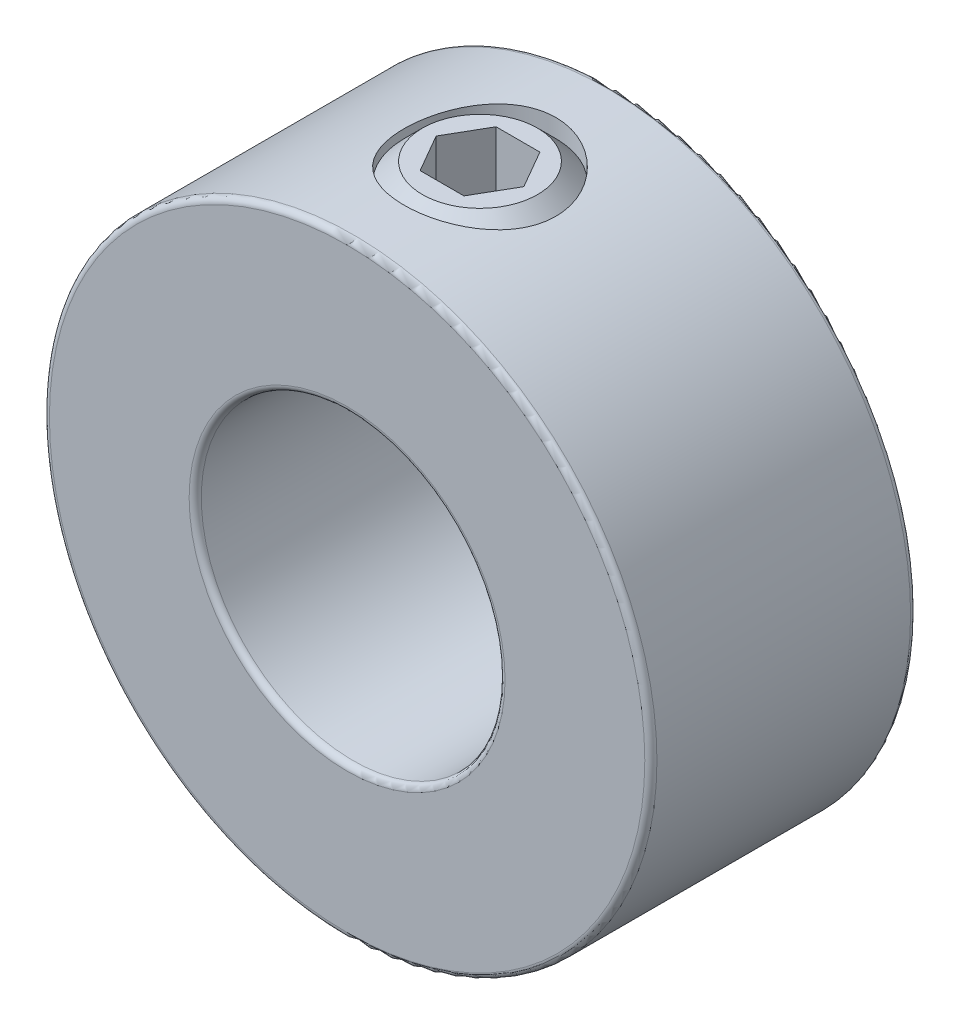
ISO-10303-21;
HEADER;
FILE_DESCRIPTION(('STEP AP214'),'2;1');
FILE_NAME('part.step','',(''),(''),'','','');
FILE_SCHEMA(('AUTOMOTIVE_DESIGN { 1 0 10303 214 1 1 1 1 }'));
ENDSEC;
DATA;
#1=APPLICATION_CONTEXT('core data for automotive mechanical design processes');
#2=APPLICATION_PROTOCOL_DEFINITION('international standard','automotive_design',2000,#1);
#3=PRODUCT_CONTEXT('',#1,'mechanical');
#4=PRODUCT('Part','Part','',(#3));
#5=PRODUCT_RELATED_PRODUCT_CATEGORY('part','',(#4));
#6=PRODUCT_DEFINITION_FORMATION('','',#4);
#7=PRODUCT_DEFINITION_CONTEXT('part definition',#1,'design');
#8=PRODUCT_DEFINITION('design','',#6,#7);
#9=PRODUCT_DEFINITION_SHAPE('','',#8);
#10=(LENGTH_UNIT() NAMED_UNIT(*) SI_UNIT(.MILLI.,.METRE.));
#11=(NAMED_UNIT(*) PLANE_ANGLE_UNIT() SI_UNIT($,.RADIAN.));
#12=(NAMED_UNIT(*) SI_UNIT($,.STERADIAN.) SOLID_ANGLE_UNIT());
#13=UNCERTAINTY_MEASURE_WITH_UNIT(LENGTH_MEASURE(1.E-05),#10,'distance_accuracy_value','');
#14=(GEOMETRIC_REPRESENTATION_CONTEXT(3) GLOBAL_UNCERTAINTY_ASSIGNED_CONTEXT((#13)) GLOBAL_UNIT_ASSIGNED_CONTEXT((#10,
#11,#12)) REPRESENTATION_CONTEXT('',''));
#15=CARTESIAN_POINT('',(0.,0.,0.));
#16=DIRECTION('',(0.,0.,1.));
#17=DIRECTION('',(1.,0.,0.));
#18=AXIS2_PLACEMENT_3D('',#15,#16,#17);
#19=CARTESIAN_POINT('',(0.,12.7,0.));
#20=DIRECTION('',(0.,1.,0.));
#21=DIRECTION('',(-1.,0.,0.));
#22=AXIS2_PLACEMENT_3D('',#19,#20,#21);
#23=PLANE('',#22);
#24=CARTESIAN_POINT('',(0.,12.7,0.));
#25=DIRECTION('',(0.,1.,0.));
#26=DIRECTION('',(-1.,0.,0.));
#27=AXIS2_PLACEMENT_3D('',#24,#25,#26);
#28=CIRCLE('',#27,2.40819263124403);
#29=CARTESIAN_POINT('',(-2.40819263124403,12.7,0.));
#30=VERTEX_POINT('',#29);
#31=EDGE_CURVE('E12',#30,#30,#28,.T.);
#32=ORIENTED_EDGE('',*,*,#31,.T.);
#33=EDGE_LOOP('',(#32));
#34=FACE_BOUND('',#33,.T.);
#35=DIRECTION('',(1.,0.,0.));
#36=VECTOR('',#35,1.);
#37=CARTESIAN_POINT('',(-0.916543552338532,12.7,-1.5875));
#38=LINE('',#37,#36);
#39=CARTESIAN_POINT('',(-0.916543552338532,12.7,-1.5875));
#40=VERTEX_POINT('',#39);
#41=CARTESIAN_POINT('',(0.916543552338531,12.7,-1.5875));
#42=VERTEX_POINT('',#41);
#43=EDGE_CURVE('E108',#40,#42,#38,.T.);
#44=ORIENTED_EDGE('',*,*,#43,.T.);
#45=DIRECTION('',(0.5,0.,0.866025403784439));
#46=VECTOR('',#45,1.);
#47=CARTESIAN_POINT('',(0.916543552338531,12.7,-1.5875));
#48=LINE('',#47,#46);
#49=CARTESIAN_POINT('',(1.83308710467706,12.7,0.));
#50=VERTEX_POINT('',#49);
#51=EDGE_CURVE('E54',#42,#50,#48,.T.);
#52=ORIENTED_EDGE('',*,*,#51,.T.);
#53=DIRECTION('',(-0.5,0.,0.866025403784439));
#54=VECTOR('',#53,1.);
#55=CARTESIAN_POINT('',(1.83308710467706,12.7,0.));
#56=LINE('',#55,#54);
#57=CARTESIAN_POINT('',(0.916543552338533,12.7,1.5875));
#58=VERTEX_POINT('',#57);
#59=EDGE_CURVE('E112',#50,#58,#56,.T.);
#60=ORIENTED_EDGE('',*,*,#59,.T.);
#61=DIRECTION('',(-1.,0.,0.));
#62=VECTOR('',#61,1.);
#63=CARTESIAN_POINT('',(0.916543552338533,12.7,1.5875));
#64=LINE('',#63,#62);
#65=CARTESIAN_POINT('',(-0.916543552338531,12.7,1.5875));
#66=VERTEX_POINT('',#65);
#67=EDGE_CURVE('E175',#58,#66,#64,.T.);
#68=ORIENTED_EDGE('',*,*,#67,.T.);
#69=DIRECTION('',(-0.5,0.,-0.866025403784439));
#70=VECTOR('',#69,1.);
#71=CARTESIAN_POINT('',(-0.916543552338531,12.7,1.5875));
#72=LINE('',#71,#70);
#73=CARTESIAN_POINT('',(-1.83308710467706,12.7,0.));
#74=VERTEX_POINT('',#73);
#75=EDGE_CURVE('E160',#66,#74,#72,.T.);
#76=ORIENTED_EDGE('',*,*,#75,.T.);
#77=DIRECTION('',(0.5,0.,-0.866025403784439));
#78=VECTOR('',#77,1.);
#79=CARTESIAN_POINT('',(-1.83308710467706,12.7,0.));
#80=LINE('',#79,#78);
#81=EDGE_CURVE('E156',#74,#40,#80,.T.);
#82=ORIENTED_EDGE('',*,*,#81,.T.);
#83=EDGE_LOOP('',(#44,#52,#60,#68,#76,#82));
#84=FACE_BOUND('',#83,.T.);
#85=ADVANCED_FACE('F40',(#34,#84),#23,.T.);
#86=CARTESIAN_POINT('',(0.,12.7,0.));
#87=DIRECTION('',(0.,-1.,0.));
#88=DIRECTION('',(1.,0.,0.));
#89=AXIS2_PLACEMENT_3D('',#86,#87,#88);
#90=CONICAL_SURFACE('',#89,2.40819263124403,0.785398163397448);
#91=CARTESIAN_POINT('',(0.,11.933192631244,0.));
#92=DIRECTION('',(0.,1.,0.));
#93=DIRECTION('',(-1.,0.,0.));
#94=AXIS2_PLACEMENT_3D('',#91,#92,#93);
#95=CIRCLE('',#94,3.175);
#96=CARTESIAN_POINT('',(-3.175,11.933192631244,0.));
#97=VERTEX_POINT('',#96);
#98=EDGE_CURVE('E47',#97,#97,#95,.T.);
#99=ORIENTED_EDGE('',*,*,#98,.T.);
#100=EDGE_LOOP('',(#99));
#101=FACE_BOUND('',#100,.T.);
#102=ORIENTED_EDGE('',*,*,#31,.F.);
#103=EDGE_LOOP('',(#102));
#104=FACE_BOUND('',#103,.T.);
#105=ADVANCED_FACE('F130',(#101,#104),#90,.T.);
#106=CARTESIAN_POINT('',(0.,6.35,0.));
#107=DIRECTION('',(0.,1.,0.));
#108=DIRECTION('',(-1.,0.,0.));
#109=AXIS2_PLACEMENT_3D('',#106,#107,#108);
#110=CYLINDRICAL_SURFACE('',#109,3.175);
#111=CARTESIAN_POINT('',(0.,7.11680736875596,0.));
#112=DIRECTION('',(0.,1.,0.));
#113=DIRECTION('',(-1.,0.,0.));
#114=AXIS2_PLACEMENT_3D('',#111,#112,#113);
#115=CIRCLE('',#114,3.175);
#116=CARTESIAN_POINT('',(-3.175,7.11680736875596,0.));
#117=VERTEX_POINT('',#116);
#118=EDGE_CURVE('E125',#117,#117,#115,.T.);
#119=ORIENTED_EDGE('',*,*,#118,.T.);
#120=EDGE_LOOP('',(#119));
#121=FACE_BOUND('',#120,.T.);
#122=ORIENTED_EDGE('',*,*,#98,.F.);
#123=EDGE_LOOP('',(#122));
#124=FACE_BOUND('',#123,.T.);
#125=ADVANCED_FACE('F133',(#121,#124),#110,.T.);
#126=CARTESIAN_POINT('',(0.,7.11680736875596,0.));
#127=DIRECTION('',(0.,1.,0.));
#128=DIRECTION('',(-1.,0.,0.));
#129=AXIS2_PLACEMENT_3D('',#126,#127,#128);
#130=CONICAL_SURFACE('',#129,3.175,0.785398163397449);
#131=CARTESIAN_POINT('',(0.,6.35,0.));
#132=DIRECTION('',(0.,1.,0.));
#133=DIRECTION('',(-1.,0.,0.));
#134=AXIS2_PLACEMENT_3D('',#131,#132,#133);
#135=CIRCLE('',#134,2.40819263124403);
#136=CARTESIAN_POINT('',(-2.40819263124403,6.35,0.));
#137=VERTEX_POINT('',#136);
#138=EDGE_CURVE('E117',#137,#137,#135,.T.);
#139=ORIENTED_EDGE('',*,*,#138,.T.);
#140=EDGE_LOOP('',(#139));
#141=FACE_BOUND('',#140,.T.);
#142=ORIENTED_EDGE('',*,*,#118,.F.);
#143=EDGE_LOOP('',(#142));
#144=FACE_BOUND('',#143,.T.);
#145=ADVANCED_FACE('F135',(#141,#144),#130,.T.);
#146=CARTESIAN_POINT('',(-2.40819263124403,6.35,0.));
#147=DIRECTION('',(0.,-1.,0.));
#148=DIRECTION('',(1.,0.,0.));
#149=AXIS2_PLACEMENT_3D('',#146,#147,#148);
#150=PLANE('',#149);
#151=CARTESIAN_POINT('',(0.,6.35,0.));
#152=DIRECTION('',(0.,1.,0.));
#153=DIRECTION('',(-1.,0.,0.));
#154=AXIS2_PLACEMENT_3D('',#151,#152,#153);
#155=CIRCLE('',#154,0.920168842507158);
#156=CARTESIAN_POINT('',(-0.920168842507158,6.35,0.));
#157=VERTEX_POINT('',#156);
#158=EDGE_CURVE('E113',#157,#157,#155,.T.);
#159=ORIENTED_EDGE('',*,*,#158,.T.);
#160=EDGE_LOOP('',(#159));
#161=FACE_BOUND('',#160,.T.);
#162=ORIENTED_EDGE('',*,*,#138,.F.);
#163=EDGE_LOOP('',(#162));
#164=FACE_BOUND('',#163,.T.);
#165=ADVANCED_FACE('F142',(#161,#164),#150,.T.);
#166=CARTESIAN_POINT('',(0.,6.35,0.));
#167=DIRECTION('',(0.,-1.,0.));
#168=DIRECTION('',(1.,0.,0.));
#169=AXIS2_PLACEMENT_3D('',#166,#167,#168);
#170=CONICAL_SURFACE('',#169,0.920168842507158,0.785398163397448);
#171=CARTESIAN_POINT('',(0.,7.27016884250716,0.));
#172=VERTEX_POINT('',#171);
#173=VERTEX_LOOP('',#172);
#174=FACE_BOUND('',#173,.T.);
#175=ORIENTED_EDGE('',*,*,#158,.F.);
#176=EDGE_LOOP('',(#175));
#177=FACE_BOUND('',#176,.T.);
#178=ADVANCED_FACE('F209',(#174,#177),#170,.F.);
#179=CARTESIAN_POINT('',(0.916543552338531,9.52499999999999,-1.5875));
#180=DIRECTION('',(-0.866025403784439,0.,0.5));
#181=DIRECTION('',(0.5,0.,0.866025403784439));
#182=AXIS2_PLACEMENT_3D('',#179,#180,#181);
#183=PLANE('',#182);
#184=ORIENTED_EDGE('',*,*,#51,.F.);
#185=DIRECTION('',(0.,1.,0.));
#186=VECTOR('',#185,1.);
#187=CARTESIAN_POINT('',(0.916543552338531,9.52499999999999,-1.5875));
#188=LINE('',#187,#186);
#189=CARTESIAN_POINT('',(0.916543552338531,9.52499999999999,-1.5875));
#190=VERTEX_POINT('',#189);
#191=EDGE_CURVE('E107',#190,#42,#188,.T.);
#192=ORIENTED_EDGE('',*,*,#191,.F.);
#193=DIRECTION('',(0.5,0.,0.866025403784439));
#194=VECTOR('',#193,1.);
#195=CARTESIAN_POINT('',(0.916543552338531,9.52499999999999,-1.5875));
#196=LINE('',#195,#194);
#197=CARTESIAN_POINT('',(1.83308710467706,9.52499999999999,0.));
#198=VERTEX_POINT('',#197);
#199=EDGE_CURVE('E98',#190,#198,#196,.T.);
#200=ORIENTED_EDGE('',*,*,#199,.T.);
#201=DIRECTION('',(0.,1.,0.));
#202=VECTOR('',#201,1.);
#203=CARTESIAN_POINT('',(1.83308710467706,9.52499999999999,0.));
#204=LINE('',#203,#202);
#205=EDGE_CURVE('E106',#198,#50,#204,.T.);
#206=ORIENTED_EDGE('',*,*,#205,.T.);
#207=EDGE_LOOP('',(#184,#192,#200,#206));
#208=FACE_BOUND('',#207,.T.);
#209=ADVANCED_FACE('F105',(#208),#183,.T.);
#210=CARTESIAN_POINT('',(1.83308710467706,9.52499999999999,0.));
#211=DIRECTION('',(-0.866025403784439,0.,-0.5));
#212=DIRECTION('',(-0.5,0.,0.866025403784439));
#213=AXIS2_PLACEMENT_3D('',#210,#211,#212);
#214=PLANE('',#213);
#215=ORIENTED_EDGE('',*,*,#59,.F.);
#216=ORIENTED_EDGE('',*,*,#205,.F.);
#217=DIRECTION('',(-0.5,0.,0.866025403784439));
#218=VECTOR('',#217,1.);
#219=CARTESIAN_POINT('',(1.83308710467706,9.52499999999999,0.));
#220=LINE('',#219,#218);
#221=CARTESIAN_POINT('',(0.916543552338533,9.52499999999999,1.5875));
#222=VERTEX_POINT('',#221);
#223=EDGE_CURVE('E94',#198,#222,#220,.T.);
#224=ORIENTED_EDGE('',*,*,#223,.T.);
#225=DIRECTION('',(0.,1.,0.));
#226=VECTOR('',#225,1.);
#227=CARTESIAN_POINT('',(0.916543552338533,9.52499999999999,1.5875));
#228=LINE('',#227,#226);
#229=EDGE_CURVE('E114',#222,#58,#228,.T.);
#230=ORIENTED_EDGE('',*,*,#229,.T.);
#231=EDGE_LOOP('',(#215,#216,#224,#230));
#232=FACE_BOUND('',#231,.T.);
#233=ADVANCED_FACE('F110',(#232),#214,.T.);
#234=CARTESIAN_POINT('',(0.916543552338533,9.52499999999999,1.5875));
#235=DIRECTION('',(0.,0.,-1.));
#236=DIRECTION('',(-1.,0.,0.));
#237=AXIS2_PLACEMENT_3D('',#234,#235,#236);
#238=PLANE('',#237);
#239=ORIENTED_EDGE('',*,*,#67,.F.);
#240=ORIENTED_EDGE('',*,*,#229,.F.);
#241=DIRECTION('',(-1.,0.,0.));
#242=VECTOR('',#241,1.);
#243=CARTESIAN_POINT('',(0.916543552338533,9.52499999999999,1.5875));
#244=LINE('',#243,#242);
#245=CARTESIAN_POINT('',(-0.916543552338531,9.52499999999999,1.5875));
#246=VERTEX_POINT('',#245);
#247=EDGE_CURVE('E100',#222,#246,#244,.T.);
#248=ORIENTED_EDGE('',*,*,#247,.T.);
#249=DIRECTION('',(0.,1.,0.));
#250=VECTOR('',#249,1.);
#251=CARTESIAN_POINT('',(-0.916543552338531,9.52499999999999,1.5875));
#252=LINE('',#251,#250);
#253=EDGE_CURVE('E119',#246,#66,#252,.T.);
#254=ORIENTED_EDGE('',*,*,#253,.T.);
#255=EDGE_LOOP('',(#239,#240,#248,#254));
#256=FACE_BOUND('',#255,.T.);
#257=ADVANCED_FACE('F173',(#256),#238,.T.);
#258=CARTESIAN_POINT('',(-0.916543552338531,9.52499999999999,1.5875));
#259=DIRECTION('',(0.866025403784439,0.,-0.5));
#260=DIRECTION('',(-0.5,0.,-0.866025403784439));
#261=AXIS2_PLACEMENT_3D('',#258,#259,#260);
#262=PLANE('',#261);
#263=ORIENTED_EDGE('',*,*,#75,.F.);
#264=ORIENTED_EDGE('',*,*,#253,.F.);
#265=DIRECTION('',(-0.5,0.,-0.866025403784439));
#266=VECTOR('',#265,1.);
#267=CARTESIAN_POINT('',(-0.916543552338531,9.52499999999999,1.5875));
#268=LINE('',#267,#266);
#269=CARTESIAN_POINT('',(-1.83308710467706,9.52499999999999,0.));
#270=VERTEX_POINT('',#269);
#271=EDGE_CURVE('E186',#246,#270,#268,.T.);
#272=ORIENTED_EDGE('',*,*,#271,.T.);
#273=DIRECTION('',(0.,1.,0.));
#274=VECTOR('',#273,1.);
#275=CARTESIAN_POINT('',(-1.83308710467706,9.52499999999999,0.));
#276=LINE('',#275,#274);
#277=EDGE_CURVE('E168',#270,#74,#276,.T.);
#278=ORIENTED_EDGE('',*,*,#277,.T.);
#279=EDGE_LOOP('',(#263,#264,#272,#278));
#280=FACE_BOUND('',#279,.T.);
#281=ADVANCED_FACE('F177',(#280),#262,.T.);
#282=CARTESIAN_POINT('',(-1.83308710467706,9.52499999999999,0.));
#283=DIRECTION('',(0.866025403784439,0.,0.5));
#284=DIRECTION('',(0.5,0.,-0.866025403784439));
#285=AXIS2_PLACEMENT_3D('',#282,#283,#284);
#286=PLANE('',#285);
#287=ORIENTED_EDGE('',*,*,#81,.F.);
#288=ORIENTED_EDGE('',*,*,#277,.F.);
#289=DIRECTION('',(0.5,0.,-0.866025403784439));
#290=VECTOR('',#289,1.);
#291=CARTESIAN_POINT('',(-1.83308710467706,9.52499999999999,0.));
#292=LINE('',#291,#290);
#293=CARTESIAN_POINT('',(-0.916543552338532,9.52499999999999,-1.5875));
#294=VERTEX_POINT('',#293);
#295=EDGE_CURVE('E184',#270,#294,#292,.T.);
#296=ORIENTED_EDGE('',*,*,#295,.T.);
#297=DIRECTION('',(0.,1.,0.));
#298=VECTOR('',#297,1.);
#299=CARTESIAN_POINT('',(-0.916543552338532,9.52499999999999,-1.5875));
#300=LINE('',#299,#298);
#301=EDGE_CURVE('E165',#294,#40,#300,.T.);
#302=ORIENTED_EDGE('',*,*,#301,.T.);
#303=EDGE_LOOP('',(#287,#288,#296,#302));
#304=FACE_BOUND('',#303,.T.);
#305=ADVANCED_FACE('F190',(#304),#286,.T.);
#306=CARTESIAN_POINT('',(-0.916543552338532,9.52499999999999,-1.5875));
#307=DIRECTION('',(0.,0.,1.));
#308=DIRECTION('',(1.,0.,0.));
#309=AXIS2_PLACEMENT_3D('',#306,#307,#308);
#310=PLANE('',#309);
#311=ORIENTED_EDGE('',*,*,#43,.F.);
#312=ORIENTED_EDGE('',*,*,#301,.F.);
#313=DIRECTION('',(1.,0.,0.));
#314=VECTOR('',#313,1.);
#315=CARTESIAN_POINT('',(-0.916543552338532,9.52499999999999,-1.5875));
#316=LINE('',#315,#314);
#317=EDGE_CURVE('E166',#294,#190,#316,.T.);
#318=ORIENTED_EDGE('',*,*,#317,.T.);
#319=ORIENTED_EDGE('',*,*,#191,.T.);
#320=EDGE_LOOP('',(#311,#312,#318,#319));
#321=FACE_BOUND('',#320,.T.);
#322=ADVANCED_FACE('F191',(#321),#310,.T.);
#323=CARTESIAN_POINT('',(0.916543552338531,9.52499999999999,-1.5875));
#324=DIRECTION('',(0.,1.,0.));
#325=DIRECTION('',(0.,0.,1.));
#326=AXIS2_PLACEMENT_3D('',#323,#324,#325);
#327=PLANE('',#326);
#328=ORIENTED_EDGE('',*,*,#199,.F.);
#329=ORIENTED_EDGE('',*,*,#317,.F.);
#330=ORIENTED_EDGE('',*,*,#295,.F.);
#331=ORIENTED_EDGE('',*,*,#271,.F.);
#332=ORIENTED_EDGE('',*,*,#247,.F.);
#333=ORIENTED_EDGE('',*,*,#223,.F.);
#334=EDGE_LOOP('',(#328,#329,#330,#331,#332,#333));
#335=FACE_BOUND('',#334,.T.);
#336=ADVANCED_FACE('F96',(#335),#327,.T.);
#337=CLOSED_SHELL('',(#85,#105,#125,#145,#165,#178,#209,#233,#257,#281,#305,#322,#336));
#338=MANIFOLD_SOLID_BREP('B2',#337);
#339=CARTESIAN_POINT('',(0.,0.,5.55625));
#340=DIRECTION('',(0.,0.,1.));
#341=DIRECTION('',(1.,0.,0.));
#342=AXIS2_PLACEMENT_3D('',#339,#340,#341);
#343=PLANE('',#342);
#344=CARTESIAN_POINT('',(0.,0.,5.55625));
#345=DIRECTION('',(0.,0.,1.));
#346=DIRECTION('',(1.,0.,0.));
#347=AXIS2_PLACEMENT_3D('',#344,#345,#346);
#348=CIRCLE('',#347,6.604);
#349=CARTESIAN_POINT('',(6.604,0.,5.55625));
#350=VERTEX_POINT('',#349);
#351=EDGE_CURVE('E305',#350,#350,#348,.F.);
#352=ORIENTED_EDGE('',*,*,#351,.T.);
#353=EDGE_LOOP('',(#352));
#354=FACE_BOUND('',#353,.T.);
#355=CARTESIAN_POINT('',(0.,0.,5.55625));
#356=DIRECTION('',(0.,0.,1.));
#357=DIRECTION('',(1.,0.,0.));
#358=AXIS2_PLACEMENT_3D('',#355,#356,#357);
#359=CIRCLE('',#358,12.446);
#360=CARTESIAN_POINT('',(12.446,0.,5.55625));
#361=VERTEX_POINT('',#360);
#362=EDGE_CURVE('E309',#361,#361,#359,.T.);
#363=ORIENTED_EDGE('',*,*,#362,.T.);
#364=EDGE_LOOP('',(#363));
#365=FACE_BOUND('',#364,.T.);
#366=ADVANCED_FACE('F294',(#354,#365),#343,.T.);
#367=CARTESIAN_POINT('',(0.,0.,-5.55625));
#368=DIRECTION('',(0.,0.,1.));
#369=DIRECTION('',(1.,0.,0.));
#370=AXIS2_PLACEMENT_3D('',#367,#368,#369);
#371=PLANE('',#370);
#372=CARTESIAN_POINT('',(0.,0.,-5.55625));
#373=DIRECTION('',(0.,0.,1.));
#374=DIRECTION('',(1.,0.,0.));
#375=AXIS2_PLACEMENT_3D('',#372,#373,#374);
#376=CIRCLE('',#375,6.604);
#377=CARTESIAN_POINT('',(6.604,0.,-5.55625));
#378=VERTEX_POINT('',#377);
#379=EDGE_CURVE('E320',#378,#378,#376,.T.);
#380=ORIENTED_EDGE('',*,*,#379,.T.);
#381=EDGE_LOOP('',(#380));
#382=FACE_BOUND('',#381,.T.);
#383=CARTESIAN_POINT('',(0.,0.,-5.55625));
#384=DIRECTION('',(0.,0.,1.));
#385=DIRECTION('',(1.,0.,0.));
#386=AXIS2_PLACEMENT_3D('',#383,#384,#385);
#387=CIRCLE('',#386,12.446);
#388=CARTESIAN_POINT('',(12.446,0.,-5.55625));
#389=VERTEX_POINT('',#388);
#390=EDGE_CURVE('E323',#389,#389,#387,.F.);
#391=ORIENTED_EDGE('',*,*,#390,.T.);
#392=EDGE_LOOP('',(#391));
#393=FACE_BOUND('',#392,.T.);
#394=ADVANCED_FACE('F357',(#382,#393),#371,.F.);
#395=CARTESIAN_POINT('',(0.,0.,5.55625));
#396=DIRECTION('',(0.,0.,-1.));
#397=DIRECTION('',(-1.,0.,0.));
#398=AXIS2_PLACEMENT_3D('',#395,#396,#397);
#399=CYLINDRICAL_SURFACE('',#398,12.7);
#400=CARTESIAN_POINT('',(0.,0.,-5.30225));
#401=DIRECTION('',(0.,0.,1.));
#402=DIRECTION('',(1.,0.,0.));
#403=AXIS2_PLACEMENT_3D('',#400,#401,#402);
#404=CIRCLE('',#403,12.7);
#405=CARTESIAN_POINT('',(12.7,0.,-5.30225));
#406=VERTEX_POINT('',#405);
#407=EDGE_CURVE('E39',#406,#406,#404,.T.);
#408=ORIENTED_EDGE('',*,*,#407,.T.);
#409=EDGE_LOOP('',(#408));
#410=FACE_BOUND('',#409,.T.);
#411=CARTESIAN_POINT('',(0.,0.,5.30225));
#412=DIRECTION('',(0.,0.,1.));
#413=DIRECTION('',(1.,0.,0.));
#414=AXIS2_PLACEMENT_3D('',#411,#412,#413);
#415=CIRCLE('',#414,12.7);
#416=CARTESIAN_POINT('',(12.7,0.,5.30225));
#417=VERTEX_POINT('',#416);
#418=EDGE_CURVE('E301',#417,#417,#415,.F.);
#419=ORIENTED_EDGE('',*,*,#418,.T.);
#420=EDGE_LOOP('',(#419));
#421=FACE_BOUND('',#420,.T.);
#422=CARTESIAN_POINT('',(0.,12.7,-3.175));
#423=CARTESIAN_POINT('',(0.175421054350931,12.6999970338729,-3.17499507718756));
#424=CARTESIAN_POINT('',(0.350897100741782,12.6963292371237,-3.16041288419548));
#425=CARTESIAN_POINT('',(0.69682005198096,12.6820530760661,-3.10255676306683));
#426=CARTESIAN_POINT('',(0.867264049209731,12.6714407780562,-3.05926657314488));
#427=CARTESIAN_POINT('',(1.19807751278645,12.6444507573613,-2.94547024683858));
#428=CARTESIAN_POINT('',(1.35845880926017,12.6280799601569,-2.87499679271934));
#429=CARTESIAN_POINT('',(1.6651226791977,12.591316443928,-2.70894939107175));
#430=CARTESIAN_POINT('',(1.81140477687155,12.5709235892463,-2.61337459688152));
#431=CARTESIAN_POINT('',(2.08873074612027,12.5278602543575,-2.39775832856532));
#432=CARTESIAN_POINT('',(2.2194428772959,12.5051546346353,-2.27729716633665));
#433=CARTESIAN_POINT('',(2.45903522924702,12.4602582924963,-2.01622616627587));
#434=CARTESIAN_POINT('',(2.56791298487579,12.4380676284689,-1.87561405642898));
#435=CARTESIAN_POINT('',(2.76230618225783,12.3963594189446,-1.57565677007337));
#436=CARTESIAN_POINT('',(2.84745052370821,12.3768864828385,-1.41606432812152));
#437=CARTESIAN_POINT('',(2.98957345643241,12.343330973648,-1.08426586198626));
#438=CARTESIAN_POINT('',(3.04655655068163,12.3292475388652,-0.912061859447231));
#439=CARTESIAN_POINT('',(3.12960773790342,12.3084267567388,-0.563576262139818));
#440=CARTESIAN_POINT('',(3.15627230130284,12.3015478927701,-0.387445470052915));
#441=CARTESIAN_POINT('',(3.17978742389056,12.2954915053947,-0.0330865289513835));
#442=CARTESIAN_POINT('',(3.176642833515,12.2963127290578,0.145141274131692));
#443=CARTESIAN_POINT('',(3.14110481048737,12.3054365167726,0.494063459727666));
#444=CARTESIAN_POINT('',(3.10942215340351,12.3135572669877,0.664835732101618));
#445=CARTESIAN_POINT('',(3.01884119561133,12.3360753547043,0.998560891095076));
#446=CARTESIAN_POINT('',(2.95994095604688,12.3504731393489,1.16151321974455));
#447=CARTESIAN_POINT('',(2.81599106163371,12.3840899110031,1.47687880106701));
#448=CARTESIAN_POINT('',(2.73068344564301,12.4033560981111,1.62916906362126));
#449=CARTESIAN_POINT('',(2.53652078423164,12.4445122129068,1.91752793565194));
#450=CARTESIAN_POINT('',(2.42766161831204,12.4664025994163,2.05359370007568));
#451=CARTESIAN_POINT('',(2.18580424890858,12.5111061380944,2.30971431988649));
#452=CARTESIAN_POINT('',(2.05220624645107,12.533927803951,2.42920200396319));
#453=CARTESIAN_POINT('',(1.76659522538283,12.5773596047503,2.64418496321526));
#454=CARTESIAN_POINT('',(1.61458164448181,12.5979696721291,2.73967950552455));
#455=CARTESIAN_POINT('',(1.29564529770895,12.6347586626604,2.90417374084162));
#456=CARTESIAN_POINT('',(1.12867311562492,12.6509221227036,2.97308130353854));
#457=CARTESIAN_POINT('',(0.785020883902435,12.676884242985,3.0816916304186));
#458=CARTESIAN_POINT('',(0.608342698201859,12.6866841206814,3.12139998108506));
#459=CARTESIAN_POINT('',(0.255142937325556,12.6986347345774,3.16961851376621));
#460=CARTESIAN_POINT('',(0.078733057308377,12.7009747992585,3.17890107185939));
#461=CARTESIAN_POINT('',(-0.273119584996527,12.6982813685726,3.16812294564922));
#462=CARTESIAN_POINT('',(-0.448562432914396,12.6932485369526,3.14806490274183));
#463=CARTESIAN_POINT('',(-0.790816868910238,12.6764961338622,3.07981157723825));
#464=CARTESIAN_POINT('',(-0.957717835150521,12.6648767569325,3.03203765897374));
#465=CARTESIAN_POINT('',(-1.28112793569116,12.6362609570897,2.91019000547309));
#466=CARTESIAN_POINT('',(-1.43763601861911,12.6192639911647,2.83611361420368));
#467=CARTESIAN_POINT('',(-1.73889063454314,12.5813250177716,2.6622668605486));
#468=CARTESIAN_POINT('',(-1.88337918521903,12.5603183592593,2.56206389542727));
#469=CARTESIAN_POINT('',(-2.15376466554501,12.5167921111412,2.33936135971267));
#470=CARTESIAN_POINT('',(-2.27965837982672,12.4942722608556,2.21685794114268));
#471=CARTESIAN_POINT('',(-2.51246336908675,12.4495762556412,1.94944584954746));
#472=CARTESIAN_POINT('',(-2.6188328531313,12.4274221051899,1.80406102865082));
#473=CARTESIAN_POINT('',(-2.80566443991221,12.3865825924258,1.49704925704163));
#474=CARTESIAN_POINT('',(-2.88612769264178,12.3678970761538,1.335423027713));
#475=CARTESIAN_POINT('',(-3.0182638402854,12.3363163381503,1.00138288757303));
#476=CARTESIAN_POINT('',(-3.07010730622843,12.3233869021911,0.829039853404032));
#477=CARTESIAN_POINT('',(-3.14398164687971,12.3047494152553,0.477711266541238));
#478=CARTESIAN_POINT('',(-3.16601904149253,12.299039785006,0.298727175343936));
#479=CARTESIAN_POINT('',(-3.17931501621074,12.2956087422145,-0.0552895005203962));
#480=CARTESIAN_POINT('',(-3.17143955029538,12.2976625750886,-0.230287904387485));
#481=CARTESIAN_POINT('',(-3.1271152390873,12.3090074061494,-0.576376564376255));
#482=CARTESIAN_POINT('',(-3.09066696801937,12.3182982588945,-0.747466898966899));
#483=CARTESIAN_POINT('',(-2.9907046261569,12.3429450180984,-1.07994123834368));
#484=CARTESIAN_POINT('',(-2.92735297324093,12.3582644892528,-1.24137696275537));
#485=CARTESIAN_POINT('',(-2.7755107337966,12.3932474960913,-1.5514433934137));
#486=CARTESIAN_POINT('',(-2.68701666057215,12.4129116342002,-1.70007231991313));
#487=CARTESIAN_POINT('',(-2.48468673461549,12.4550092586011,-1.98449063138675));
#488=CARTESIAN_POINT('',(-2.37025002816433,12.4775016056118,-2.11984393874715));
#489=CARTESIAN_POINT('',(-2.12045416901821,12.5223699100401,-2.36970791148384));
#490=CARTESIAN_POINT('',(-1.98509005500274,12.5447458385544,-2.48421362040584));
#491=CARTESIAN_POINT('',(-1.6943230585205,12.5873437112106,-2.69115393646168));
#492=CARTESIAN_POINT('',(-1.53860166056969,12.6075193062447,-2.78315126560482));
#493=CARTESIAN_POINT('',(-1.21341315929717,12.6429542453062,-2.93951546322414));
#494=CARTESIAN_POINT('',(-1.04395600927443,12.6582171100619,-3.0039021300394));
#495=CARTESIAN_POINT('',(-0.729001702698682,12.6798505941374,-3.09366037419776));
#496=CARTESIAN_POINT('',(-0.585004695088745,12.6873547169486,-3.12409679779643));
#497=CARTESIAN_POINT('',(-0.294017851418465,12.6974304774096,-3.16476791399977));
#498=CARTESIAN_POINT('',(-0.147028241296871,12.7000024860439,-3.17500412602955));
#499=CARTESIAN_POINT('',(0.,12.7,-3.175));
#500=B_SPLINE_CURVE_WITH_KNOTS('',3,(#422,#423,#424,#425,#426,#427,#428,#429,#430,#431,#432,
#433,#434,#435,#436,#437,#438,#439,#440,#441,#442,#443,#444,#445,#446,#447,#448,#449,#450,#451,
#452,#453,#454,#455,#456,#457,#458,#459,#460,#461,#462,#463,#464,#465,#466,#467,#468,#469,#470,
#471,#472,#473,#474,#475,#476,#477,#478,#479,#480,#481,#482,#483,#484,#485,#486,#487,#488,#489,
#490,#491,#492,#493,#494,#495,#496,#497,#498,#499),.UNSPECIFIED.,.T.,.F.,(4,2,2,2,2,2,2,2,2,2,2,
2,2,2,2,2,2,2,2,2,2,2,2,2,2,2,2,2,2,2,2,2,2,2,2,2,2,2,4),(0.,0.5257243580655,1.05174676993359,
1.57713870983892,2.10254837335841,2.63767221675277,3.17285644277797,3.71599137305291,
4.25903942808496,4.79120824630597,5.3232904734557,5.84247618671883,6.36169889010143,
6.88616284006739,7.41071862276906,7.95023177058119,8.48976139571985,9.0311441807632,
9.57242335981323,10.09985087283,10.6272309069567,11.1467958106174,11.6664131950588,
12.1952509368702,12.7241800170734,13.266092111565,13.8079801469349,14.34660272276,
14.885107458967,15.4081433519175,15.9311687337377,16.4510804786766,16.9710643590661,
17.5046127008447,18.0382877269755,18.5816279265763,19.1245778677202,19.5652441424438,
20.005877269746),.UNSPECIFIED.);
#501=CARTESIAN_POINT('',(0.,12.7,-3.175));
#502=VERTEX_POINT('',#501);
#503=EDGE_CURVE('E326',#502,#502,#500,.T.);
#504=ORIENTED_EDGE('',*,*,#503,.T.);
#505=EDGE_LOOP('',(#504));
#506=FACE_BOUND('',#505,.T.);
#507=ADVANCED_FACE('F353',(#410,#421,#506),#399,.T.);
#508=CARTESIAN_POINT('',(0.,0.,5.55625));
#509=DIRECTION('',(0.,0.,-1.));
#510=DIRECTION('',(-1.,0.,0.));
#511=AXIS2_PLACEMENT_3D('',#508,#509,#510);
#512=CYLINDRICAL_SURFACE('',#511,6.35);
#513=CARTESIAN_POINT('',(0.,0.,-5.30225));
#514=DIRECTION('',(0.,0.,1.));
#515=DIRECTION('',(1.,0.,0.));
#516=AXIS2_PLACEMENT_3D('',#513,#514,#515);
#517=CIRCLE('',#516,6.35);
#518=CARTESIAN_POINT('',(6.35,0.,-5.30225));
#519=VERTEX_POINT('',#518);
#520=EDGE_CURVE('E314',#519,#519,#517,.F.);
#521=ORIENTED_EDGE('',*,*,#520,.T.);
#522=EDGE_LOOP('',(#521));
#523=FACE_BOUND('',#522,.T.);
#524=CARTESIAN_POINT('',(0.,0.,5.30225));
#525=DIRECTION('',(0.,0.,1.));
#526=DIRECTION('',(1.,0.,0.));
#527=AXIS2_PLACEMENT_3D('',#524,#525,#526);
#528=CIRCLE('',#527,6.35);
#529=CARTESIAN_POINT('',(6.35,0.,5.30225));
#530=VERTEX_POINT('',#529);
#531=EDGE_CURVE('E317',#530,#530,#528,.T.);
#532=ORIENTED_EDGE('',*,*,#531,.T.);
#533=EDGE_LOOP('',(#532));
#534=FACE_BOUND('',#533,.T.);
#535=CARTESIAN_POINT('',(0.,6.35,-3.175));
#536=CARTESIAN_POINT('',(0.0834969220594998,6.34999931166444,-3.17499911228237));
#537=CARTESIAN_POINT('',(0.167002655580042,6.34834758911701,-3.17170012555404));
#538=CARTESIAN_POINT('',(0.333378330258781,6.34179105821714,-3.1585541254501));
#539=CARTESIAN_POINT('',(0.416247978955771,6.33688483467113,-3.14870426347422));
#540=CARTESIAN_POINT('',(0.66318203064701,6.31742426748325,-3.10942793495398));
#541=CARTESIAN_POINT('',(0.825450146761554,6.29812827299425,-3.0702749225986));
#542=CARTESIAN_POINT('',(1.13965128900426,6.2489182313574,-2.96800928870585));
#543=CARTESIAN_POINT('',(1.29162180811868,6.21904547786825,-2.90498978075659));
#544=CARTESIAN_POINT('',(1.58264035037879,6.15142812041637,-2.7572639263711));
#545=CARTESIAN_POINT('',(1.72168939123018,6.11368413715877,-2.67255928984904));
#546=CARTESIAN_POINT('',(1.99234108848171,6.03111096182982,-2.47803037026577));
#547=CARTESIAN_POINT('',(2.12298433900091,5.98599127270818,-2.36699642220607));
#548=CARTESIAN_POINT('',(2.36467069069853,5.89470535591056,-2.12560331642721));
#549=CARTESIAN_POINT('',(2.47569885601321,5.84853836069043,-1.99522957023356));
#550=CARTESIAN_POINT('',(2.68368848497886,5.75623634934464,-1.70657905224668));
#551=CARTESIAN_POINT('',(2.77889135161934,5.71038146176788,-1.54692246869841));
#552=CARTESIAN_POINT('',(2.90019349951534,5.64919759286363,-1.29545201282556));
#553=CARTESIAN_POINT('',(2.93705266116891,5.63006420805933,-1.20959993817132));
#554=CARTESIAN_POINT('',(3.00322508739606,5.59504604853268,-1.03441438629357));
#555=CARTESIAN_POINT('',(3.03254280972159,5.57915935583429,-0.945083001819443));
#556=CARTESIAN_POINT('',(3.08174263292982,5.55212611635049,-0.768989448035253));
#557=CARTESIAN_POINT('',(3.10208128111978,5.54075429137746,-0.682389205971432));
#558=CARTESIAN_POINT('',(3.13545600360765,5.52193654886444,-0.507412721005597));
#559=CARTESIAN_POINT('',(3.14849595237257,5.51448854851135,-0.419037446228295));
#560=CARTESIAN_POINT('',(3.1670771305344,5.50383875782919,-0.241293261151379));
#561=CARTESIAN_POINT('',(3.17262287599649,5.50063441026522,-0.151924982012598));
#562=CARTESIAN_POINT('',(3.17614778806993,5.49859788398609,0.026980784178089));
#563=CARTESIAN_POINT('',(3.17412767659872,5.49976528812799,0.116518254271341));
#564=CARTESIAN_POINT('',(3.1581193033026,5.50899190362733,0.362747875724408));
#565=CARTESIAN_POINT('',(3.13621253452965,5.52160857357707,0.518841729813368));
#566=CARTESIAN_POINT('',(3.07003746372168,5.55866493052824,0.824646641306534));
#567=CARTESIAN_POINT('',(3.02576203854504,5.58310838358077,0.974355649022768));
#568=CARTESIAN_POINT('',(2.91531509833647,5.64157885407237,1.26754429656415));
#569=CARTESIAN_POINT('',(2.84865758129417,5.67581583876129,1.41079760993663));
#570=CARTESIAN_POINT('',(2.69570761526054,5.75003268807633,1.68476608617402));
#571=CARTESIAN_POINT('',(2.60940634674629,5.79001512927804,1.81547557960851));
#572=CARTESIAN_POINT('',(2.40685964249565,5.87734289018611,2.0781042742503));
#573=CARTESIAN_POINT('',(2.28820488335253,5.92497898403936,2.20807538485651));
#574=CARTESIAN_POINT('',(2.03058898448427,6.01813700574905,2.44708514286385));
#575=CARTESIAN_POINT('',(1.89161819563546,6.06365791538158,2.5561137863587));
#576=CARTESIAN_POINT('',(1.58913989972482,6.1500381059768,2.75490191971972));
#577=CARTESIAN_POINT('',(1.42479265164788,6.19058274974572,2.84353148557995));
#578=CARTESIAN_POINT('',(1.08098023585583,6.25976272299952,2.99115808163535));
#579=CARTESIAN_POINT('',(0.901527205073894,6.28840750578946,3.05017864113171));
#580=CARTESIAN_POINT('',(0.548533610626832,6.32854759690358,3.13205940339905));
#581=CARTESIAN_POINT('',(0.375734359385243,6.34126679122995,3.15750967258734));
#582=CARTESIAN_POINT('',(0.0278752299448304,6.35231817716325,3.17965052226026));
#583=CARTESIAN_POINT('',(-0.14718353806002,6.35065718436129,3.17635472713933));
#584=CARTESIAN_POINT('',(-0.480164686080363,6.33384535408399,3.14259376405461));
#585=CARTESIAN_POINT('',(-0.638363620564191,6.31975005060431,3.11425420852516));
#586=CARTESIAN_POINT('',(-0.947441883053002,6.28085393924121,3.03454412179011));
#587=CARTESIAN_POINT('',(-1.09832040207141,6.25605195113515,2.98317105152272));
#588=CARTESIAN_POINT('',(-1.39347133182512,6.19709998236334,2.8575048690622));
#589=CARTESIAN_POINT('',(-1.53743151047822,6.16270299610717,2.78259841588881));
#590=CARTESIAN_POINT('',(-1.8112148234104,6.08787118465664,2.61268357431413));
#591=CARTESIAN_POINT('',(-1.94103189959928,6.0474337895468,2.5176666226146));
#592=CARTESIAN_POINT('',(-2.19636241342679,5.95973602709938,2.29946064962623));
#593=CARTESIAN_POINT('',(-2.3202013468198,5.91219559251098,2.17442139288844));
#594=CARTESIAN_POINT('',(-2.54589381918874,5.81858093231368,1.90523764485025));
#595=CARTESIAN_POINT('',(-2.6477321493525,5.77250773963547,1.76108004761907));
#596=CARTESIAN_POINT('',(-2.83117262876716,5.68487535288742,1.44893139804165));
#597=CARTESIAN_POINT('',(-2.91155594998014,5.64364281441821,1.28012423048962));
#598=CARTESIAN_POINT('',(-3.04191297152938,5.5744767953732,0.928655535110328));
#599=CARTESIAN_POINT('',(-3.0919258549222,5.54652618900869,0.746012202152618));
#600=CARTESIAN_POINT('',(-3.15551086037918,5.51057765714603,0.390810043529834));
#601=CARTESIAN_POINT('',(-3.17212027309711,5.50092192343245,0.218966249592787));
#602=CARTESIAN_POINT('',(-3.17718805563876,5.49800001145358,-0.125244442495205));
#603=CARTESIAN_POINT('',(-3.16565862768385,5.50472672904441,-0.297611081542638));
#604=CARTESIAN_POINT('',(-3.11761548073658,5.53205211477784,-0.620660103073908));
#605=CARTESIAN_POINT('',(-3.08358651207686,5.5512682307627,-0.771843941731147));
#606=CARTESIAN_POINT('',(-2.99458164828807,5.59977978302582,-1.06619083016717));
#607=CARTESIAN_POINT('',(-2.93959901505999,5.62907846127335,-1.2093512828503));
#608=CARTESIAN_POINT('',(-2.8061154442137,5.69685576337174,-1.49423369942854));
#609=CARTESIAN_POINT('',(-2.72628260503929,5.73581889480533,-1.63521280936567));
#610=CARTESIAN_POINT('',(-2.54682759156583,5.81772207082382,-1.9026974317231));
#611=CARTESIAN_POINT('',(-2.44719512169931,5.8606641782013,-2.02919535994271));
#612=CARTESIAN_POINT('',(-2.21680287661218,5.95192753761204,-2.28009752417706));
#613=CARTESIAN_POINT('',(-2.08373188558712,6.00026839877347,-2.40237975641279));
#614=CARTESIAN_POINT('',(-1.79751265125243,6.0921234557675,-2.62339787323311));
#615=CARTESIAN_POINT('',(-1.64435365457427,6.13563504323043,-2.72212106598272));
#616=CARTESIAN_POINT('',(-1.40178715704487,6.19391073190243,-2.85028026619707));
#617=CARTESIAN_POINT('',(-1.31842200030918,6.21223173271383,-2.88980058368139));
#618=CARTESIAN_POINT('',(-1.1480770102167,6.24595363475604,-2.9615994748237));
#619=CARTESIAN_POINT('',(-1.06109897786306,6.26135597012704,-2.99388160653437));
#620=CARTESIAN_POINT('',(-0.884361322813102,6.28875097111981,-3.050759345915));
#621=CARTESIAN_POINT('',(-0.794608244970565,6.30075106809478,-3.07537171813811));
#622=CARTESIAN_POINT('',(-0.612925661591577,6.32100983571903,-3.11666738952989));
#623=CARTESIAN_POINT('',(-0.520997521680286,6.3292707916836,-3.13335553219354));
#624=CARTESIAN_POINT('',(-0.357531347524372,6.34032503263334,-3.15561628486238));
#625=CARTESIAN_POINT('',(-0.286274046488593,6.34394670812889,-3.16287882124963));
#626=CARTESIAN_POINT('',(-0.143346668941345,6.34878452045567,-3.17257112653757));
#627=CARTESIAN_POINT('',(-0.0716765810914251,6.35000059089052,-3.17500076204682));
#628=CARTESIAN_POINT('',(0.,6.35,-3.175));
#629=B_SPLINE_CURVE_WITH_KNOTS('',3,(#535,#536,#537,#538,#539,#540,#541,#542,#543,#544,#545,
#546,#547,#548,#549,#550,#551,#552,#553,#554,#555,#556,#557,#558,#559,#560,#561,#562,#563,#564,
#565,#566,#567,#568,#569,#570,#571,#572,#573,#574,#575,#576,#577,#578,#579,#580,#581,#582,#583,
#584,#585,#586,#587,#588,#589,#590,#591,#592,#593,#594,#595,#596,#597,#598,#599,#600,#601,#602,
#603,#604,#605,#606,#607,#608,#609,#610,#611,#612,#613,#614,#615,#616,#617,#618,#619,#620,#621,
#622,#623,#624,#625,#626,#627,#628),.UNSPECIFIED.,.T.,.F.,(4,2,2,2,2,2,2,2,2,2,2,2,2,2,2,2,2,2,
2,2,2,2,2,2,2,2,2,2,2,2,2,2,2,2,2,2,2,2,2,2,2,2,2,2,2,2,4),(0.,0.25041561210268,
0.500940186864014,1.00234854488129,1.50182051324263,2.00125310940106,2.53090025348452,
3.06094897410615,3.63210298373098,3.91787290005988,4.20347350732849,4.47213270490102,
4.74064915090148,5.00900371453887,5.27733267302576,5.74927594687739,6.22136960256846,
6.70445970327764,7.18776712794021,7.73235646527881,8.27720530143646,8.84735553323666,
9.41705196489304,9.93956405039339,10.4618285011675,10.9436138594975,11.4254523397102,
11.9210677568139,12.4168946391879,12.9614122158798,13.5063050164601,14.0775857365549,
14.6481278321882,15.1639000911419,15.6794487286237,16.1458838633213,16.6124691169503,
17.1104020806943,17.6085946442304,18.1673210354482,18.7263477502426,19.0082017078365,
19.2899168101042,19.5710117490933,19.8519346536844,20.0668939492148,20.2818591776892),.UNSPECIFIED.);
#630=CARTESIAN_POINT('',(0.,6.35,-3.175));
#631=VERTEX_POINT('',#630);
#632=EDGE_CURVE('E327',#631,#631,#629,.T.);
#633=ORIENTED_EDGE('',*,*,#632,.F.);
#634=EDGE_LOOP('',(#633));
#635=FACE_BOUND('',#634,.T.);
#636=ADVANCED_FACE('F337',(#523,#534,#635),#512,.F.);
#637=CARTESIAN_POINT('',(0.,12.7,0.));
#638=DIRECTION('',(0.,-1.,0.));
#639=DIRECTION('',(0.,0.,-1.));
#640=AXIS2_PLACEMENT_3D('',#637,#638,#639);
#641=CYLINDRICAL_SURFACE('',#640,3.175);
#642=ORIENTED_EDGE('',*,*,#632,.T.);
#643=EDGE_LOOP('',(#642));
#644=FACE_BOUND('',#643,.T.);
#645=ORIENTED_EDGE('',*,*,#503,.F.);
#646=EDGE_LOOP('',(#645));
#647=FACE_BOUND('',#646,.T.);
#648=ADVANCED_FACE('F340',(#644,#647),#641,.F.);
#649=CARTESIAN_POINT('',(0.,0.,-5.30225));
#650=DIRECTION('',(0.,0.,1.));
#651=DIRECTION('',(1.,0.,0.));
#652=AXIS2_PLACEMENT_3D('',#649,#650,#651);
#653=TOROIDAL_SURFACE('',#652,6.604,0.254);
#654=ORIENTED_EDGE('',*,*,#520,.F.);
#655=EDGE_LOOP('',(#654));
#656=FACE_BOUND('',#655,.T.);
#657=ORIENTED_EDGE('',*,*,#379,.F.);
#658=EDGE_LOOP('',(#657));
#659=FACE_BOUND('',#658,.T.);
#660=ADVANCED_FACE('F343',(#656,#659),#653,.T.);
#661=CARTESIAN_POINT('',(0.,0.,5.30225));
#662=DIRECTION('',(0.,0.,1.));
#663=DIRECTION('',(1.,0.,0.));
#664=AXIS2_PLACEMENT_3D('',#661,#662,#663);
#665=TOROIDAL_SURFACE('',#664,6.604,0.254);
#666=ORIENTED_EDGE('',*,*,#351,.F.);
#667=EDGE_LOOP('',(#666));
#668=FACE_BOUND('',#667,.T.);
#669=ORIENTED_EDGE('',*,*,#531,.F.);
#670=EDGE_LOOP('',(#669));
#671=FACE_BOUND('',#670,.T.);
#672=ADVANCED_FACE('F350',(#668,#671),#665,.T.);
#673=CARTESIAN_POINT('',(0.,0.,-5.30225));
#674=DIRECTION('',(0.,0.,1.));
#675=DIRECTION('',(1.,0.,0.));
#676=AXIS2_PLACEMENT_3D('',#673,#674,#675);
#677=TOROIDAL_SURFACE('',#676,12.446,0.254);
#678=ORIENTED_EDGE('',*,*,#390,.F.);
#679=EDGE_LOOP('',(#678));
#680=FACE_BOUND('',#679,.T.);
#681=ORIENTED_EDGE('',*,*,#407,.F.);
#682=EDGE_LOOP('',(#681));
#683=FACE_BOUND('',#682,.T.);
#684=ADVANCED_FACE('F369',(#680,#683),#677,.T.);
#685=CARTESIAN_POINT('',(0.,0.,5.30225));
#686=DIRECTION('',(0.,0.,1.));
#687=DIRECTION('',(1.,0.,0.));
#688=AXIS2_PLACEMENT_3D('',#685,#686,#687);
#689=TOROIDAL_SURFACE('',#688,12.446,0.254);
#690=ORIENTED_EDGE('',*,*,#418,.F.);
#691=EDGE_LOOP('',(#690));
#692=FACE_BOUND('',#691,.T.);
#693=ORIENTED_EDGE('',*,*,#362,.F.);
#694=EDGE_LOOP('',(#693));
#695=FACE_BOUND('',#694,.T.);
#696=ADVANCED_FACE('F296',(#692,#695),#689,.T.);
#697=CLOSED_SHELL('',(#366,#394,#507,#636,#648,#660,#672,#684,#696));
#698=MANIFOLD_SOLID_BREP('B6',#697);
#699=ADVANCED_BREP_SHAPE_REPRESENTATION('',(#18,#338,#698),#14);
#700=SHAPE_DEFINITION_REPRESENTATION(#9,#699);
ENDSEC;
END-ISO-10303-21;
